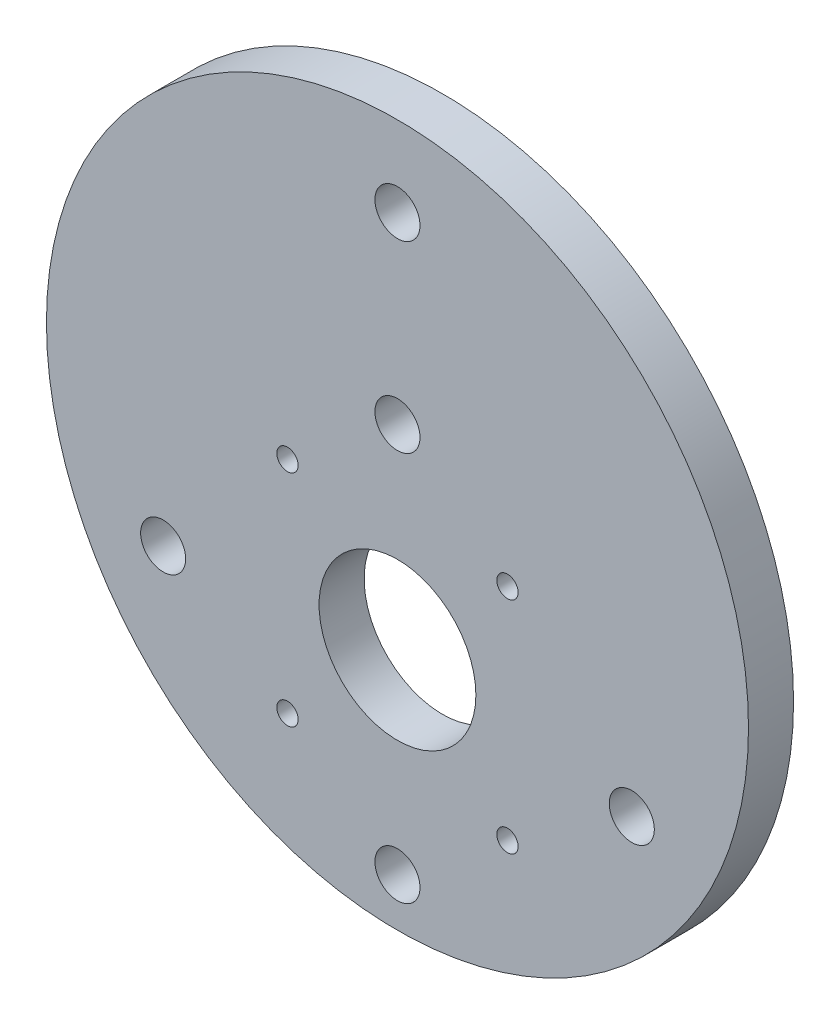
ISO-10303-21;
HEADER;
FILE_DESCRIPTION(('STEP AP214'),'2;1');
FILE_NAME('part.step','',(''),(''),'','','');
FILE_SCHEMA(('AUTOMOTIVE_DESIGN { 1 0 10303 214 1 1 1 1 }'));
ENDSEC;
DATA;
#1=APPLICATION_CONTEXT('core data for automotive mechanical design processes');
#2=APPLICATION_PROTOCOL_DEFINITION('international standard','automotive_design',2000,#1);
#3=PRODUCT_CONTEXT('',#1,'mechanical');
#4=PRODUCT('Part','Part','',(#3));
#5=PRODUCT_RELATED_PRODUCT_CATEGORY('part','',(#4));
#6=PRODUCT_DEFINITION_FORMATION('','',#4);
#7=PRODUCT_DEFINITION_CONTEXT('part definition',#1,'design');
#8=PRODUCT_DEFINITION('design','',#6,#7);
#9=PRODUCT_DEFINITION_SHAPE('','',#8);
#10=(LENGTH_UNIT() NAMED_UNIT(*) SI_UNIT(.MILLI.,.METRE.));
#11=(NAMED_UNIT(*) PLANE_ANGLE_UNIT() SI_UNIT($,.RADIAN.));
#12=(NAMED_UNIT(*) SI_UNIT($,.STERADIAN.) SOLID_ANGLE_UNIT());
#13=UNCERTAINTY_MEASURE_WITH_UNIT(LENGTH_MEASURE(1.E-05),#10,'distance_accuracy_value','');
#14=(GEOMETRIC_REPRESENTATION_CONTEXT(3) GLOBAL_UNCERTAINTY_ASSIGNED_CONTEXT((#13)) GLOBAL_UNIT_ASSIGNED_CONTEXT((#10,
#11,#12)) REPRESENTATION_CONTEXT('',''));
#15=CARTESIAN_POINT('',(0.,0.,0.));
#16=DIRECTION('',(0.,0.,1.));
#17=DIRECTION('',(1.,0.,0.));
#18=AXIS2_PLACEMENT_3D('',#15,#16,#17);
#19=CARTESIAN_POINT('',(0.,0.,6.35));
#20=DIRECTION('',(0.,0.,-1.));
#21=DIRECTION('',(-1.,0.,0.));
#22=AXIS2_PLACEMENT_3D('',#19,#20,#21);
#23=CYLINDRICAL_SURFACE('',#22,49.4665);
#24=CARTESIAN_POINT('',(0.,0.,6.35));
#25=DIRECTION('',(0.,0.,1.));
#26=DIRECTION('',(1.,0.,0.));
#27=AXIS2_PLACEMENT_3D('',#24,#25,#26);
#28=CIRCLE('',#27,49.4665);
#29=CARTESIAN_POINT('',(49.4665,0.,6.35));
#30=VERTEX_POINT('',#29);
#31=EDGE_CURVE('E10',#30,#30,#28,.T.);
#32=ORIENTED_EDGE('',*,*,#31,.F.);
#33=EDGE_LOOP('',(#32));
#34=FACE_BOUND('',#33,.T.);
#35=CARTESIAN_POINT('',(0.,0.,0.));
#36=DIRECTION('',(0.,0.,1.));
#37=DIRECTION('',(1.,0.,0.));
#38=AXIS2_PLACEMENT_3D('',#35,#36,#37);
#39=CIRCLE('',#38,49.4665);
#40=CARTESIAN_POINT('',(49.4665,0.,0.));
#41=VERTEX_POINT('',#40);
#42=EDGE_CURVE('E35',#41,#41,#39,.T.);
#43=ORIENTED_EDGE('',*,*,#42,.T.);
#44=EDGE_LOOP('',(#43));
#45=FACE_BOUND('',#44,.T.);
#46=ADVANCED_FACE('F32',(#34,#45),#23,.T.);
#47=CARTESIAN_POINT('',(0.,0.,6.35));
#48=DIRECTION('',(0.,0.,1.));
#49=DIRECTION('',(1.,0.,0.));
#50=AXIS2_PLACEMENT_3D('',#47,#48,#49);
#51=PLANE('',#50);
#52=CARTESIAN_POINT('',(0.,-15.24,6.35));
#53=DIRECTION('',(0.,0.,1.));
#54=DIRECTION('',(1.,0.,0.));
#55=AXIS2_PLACEMENT_3D('',#52,#53,#54);
#56=CIRCLE('',#55,11.049);
#57=CARTESIAN_POINT('',(11.049,-15.24,6.35));
#58=VERTEX_POINT('',#57);
#59=EDGE_CURVE('E98',#58,#58,#56,.T.);
#60=ORIENTED_EDGE('',*,*,#59,.F.);
#61=EDGE_LOOP('',(#60));
#62=FACE_BOUND('',#61,.T.);
#63=CARTESIAN_POINT('',(0.,38.128211777283,6.35));
#64=DIRECTION('',(0.,0.,1.));
#65=DIRECTION('',(1.,0.,0.));
#66=AXIS2_PLACEMENT_3D('',#63,#64,#65);
#67=CIRCLE('',#66,3.175);
#68=CARTESIAN_POINT('',(3.175,38.128211777283,6.35));
#69=VERTEX_POINT('',#68);
#70=EDGE_CURVE('E93',#69,#69,#67,.T.);
#71=ORIENTED_EDGE('',*,*,#70,.F.);
#72=EDGE_LOOP('',(#71));
#73=FACE_BOUND('',#72,.T.);
#74=CARTESIAN_POINT('',(-33.0200000000003,-19.0641058886412,6.35));
#75=DIRECTION('',(0.,0.,1.));
#76=DIRECTION('',(1.,0.,0.));
#77=AXIS2_PLACEMENT_3D('',#74,#75,#76);
#78=CIRCLE('',#77,3.175);
#79=CARTESIAN_POINT('',(-29.8450000000003,-19.0641058886412,6.35));
#80=VERTEX_POINT('',#79);
#81=EDGE_CURVE('E87',#80,#80,#78,.T.);
#82=ORIENTED_EDGE('',*,*,#81,.F.);
#83=EDGE_LOOP('',(#82));
#84=FACE_BOUND('',#83,.T.);
#85=CARTESIAN_POINT('',(33.0200000000003,-19.0641058886412,6.35));
#86=DIRECTION('',(0.,0.,1.));
#87=DIRECTION('',(1.,0.,0.));
#88=AXIS2_PLACEMENT_3D('',#85,#86,#87);
#89=CIRCLE('',#88,3.175);
#90=CARTESIAN_POINT('',(36.1950000000003,-19.0641058886412,6.35));
#91=VERTEX_POINT('',#90);
#92=EDGE_CURVE('E80',#91,#91,#89,.T.);
#93=ORIENTED_EDGE('',*,*,#92,.F.);
#94=EDGE_LOOP('',(#93));
#95=FACE_BOUND('',#94,.T.);
#96=CARTESIAN_POINT('',(0.,-42.672,6.35));
#97=DIRECTION('',(0.,0.,1.));
#98=DIRECTION('',(1.,0.,0.));
#99=AXIS2_PLACEMENT_3D('',#96,#97,#98);
#100=CIRCLE('',#99,3.175);
#101=CARTESIAN_POINT('',(3.17499999999999,-42.672,6.35));
#102=VERTEX_POINT('',#101);
#103=EDGE_CURVE('E75',#102,#102,#100,.T.);
#104=ORIENTED_EDGE('',*,*,#103,.F.);
#105=EDGE_LOOP('',(#104));
#106=FACE_BOUND('',#105,.T.);
#107=CARTESIAN_POINT('',(0.,12.26,6.35));
#108=DIRECTION('',(0.,0.,1.));
#109=DIRECTION('',(1.,0.,0.));
#110=AXIS2_PLACEMENT_3D('',#107,#108,#109);
#111=CIRCLE('',#110,3.175);
#112=CARTESIAN_POINT('',(3.175,12.26,6.35));
#113=VERTEX_POINT('',#112);
#114=EDGE_CURVE('E71',#113,#113,#111,.T.);
#115=ORIENTED_EDGE('',*,*,#114,.F.);
#116=EDGE_LOOP('',(#115));
#117=FACE_BOUND('',#116,.T.);
#118=CARTESIAN_POINT('',(15.5,0.260000000000003,6.35));
#119=DIRECTION('',(0.,0.,1.));
#120=DIRECTION('',(1.,0.,0.));
#121=AXIS2_PLACEMENT_3D('',#118,#119,#120);
#122=CIRCLE('',#121,1.5);
#123=CARTESIAN_POINT('',(17.,0.260000000000003,6.35));
#124=VERTEX_POINT('',#123);
#125=EDGE_CURVE('E64',#124,#124,#122,.T.);
#126=ORIENTED_EDGE('',*,*,#125,.F.);
#127=EDGE_LOOP('',(#126));
#128=FACE_BOUND('',#127,.T.);
#129=CARTESIAN_POINT('',(-15.5,0.260000000000003,6.35));
#130=DIRECTION('',(0.,0.,1.));
#131=DIRECTION('',(1.,0.,0.));
#132=AXIS2_PLACEMENT_3D('',#129,#130,#131);
#133=CIRCLE('',#132,1.5);
#134=CARTESIAN_POINT('',(-14.,0.260000000000003,6.35));
#135=VERTEX_POINT('',#134);
#136=EDGE_CURVE('E58',#135,#135,#133,.T.);
#137=ORIENTED_EDGE('',*,*,#136,.F.);
#138=EDGE_LOOP('',(#137));
#139=FACE_BOUND('',#138,.T.);
#140=CARTESIAN_POINT('',(-15.5,-30.74,6.35));
#141=DIRECTION('',(0.,0.,1.));
#142=DIRECTION('',(1.,0.,0.));
#143=AXIS2_PLACEMENT_3D('',#140,#141,#142);
#144=CIRCLE('',#143,1.5);
#145=CARTESIAN_POINT('',(-14.,-30.74,6.35));
#146=VERTEX_POINT('',#145);
#147=EDGE_CURVE('E52',#146,#146,#144,.T.);
#148=ORIENTED_EDGE('',*,*,#147,.F.);
#149=EDGE_LOOP('',(#148));
#150=FACE_BOUND('',#149,.T.);
#151=CARTESIAN_POINT('',(15.5,-30.74,6.35));
#152=DIRECTION('',(0.,0.,1.));
#153=DIRECTION('',(1.,0.,0.));
#154=AXIS2_PLACEMENT_3D('',#151,#152,#153);
#155=CIRCLE('',#154,1.5);
#156=CARTESIAN_POINT('',(17.,-30.74,6.35));
#157=VERTEX_POINT('',#156);
#158=EDGE_CURVE('E46',#157,#157,#155,.T.);
#159=ORIENTED_EDGE('',*,*,#158,.F.);
#160=EDGE_LOOP('',(#159));
#161=FACE_BOUND('',#160,.T.);
#162=ORIENTED_EDGE('',*,*,#31,.T.);
#163=EDGE_LOOP('',(#162));
#164=FACE_BOUND('',#163,.T.);
#165=ADVANCED_FACE('F114',(#62,#73,#84,#95,#106,#117,#128,#139,#150,#161,#164),#51,.T.);
#166=CARTESIAN_POINT('',(0.,0.,0.));
#167=DIRECTION('',(0.,0.,1.));
#168=DIRECTION('',(1.,0.,0.));
#169=AXIS2_PLACEMENT_3D('',#166,#167,#168);
#170=PLANE('',#169);
#171=CARTESIAN_POINT('',(0.,-15.24,0.));
#172=DIRECTION('',(0.,0.,1.));
#173=DIRECTION('',(1.,0.,0.));
#174=AXIS2_PLACEMENT_3D('',#171,#172,#173);
#175=CIRCLE('',#174,11.049);
#176=CARTESIAN_POINT('',(11.049,-15.24,0.));
#177=VERTEX_POINT('',#176);
#178=EDGE_CURVE('E84',#177,#177,#175,.T.);
#179=ORIENTED_EDGE('',*,*,#178,.T.);
#180=EDGE_LOOP('',(#179));
#181=FACE_BOUND('',#180,.T.);
#182=CARTESIAN_POINT('',(0.,38.128211777283,0.));
#183=DIRECTION('',(0.,0.,1.));
#184=DIRECTION('',(1.,0.,0.));
#185=AXIS2_PLACEMENT_3D('',#182,#183,#184);
#186=CIRCLE('',#185,3.175);
#187=CARTESIAN_POINT('',(3.175,38.128211777283,0.));
#188=VERTEX_POINT('',#187);
#189=EDGE_CURVE('E72',#188,#188,#186,.T.);
#190=ORIENTED_EDGE('',*,*,#189,.T.);
#191=EDGE_LOOP('',(#190));
#192=FACE_BOUND('',#191,.T.);
#193=CARTESIAN_POINT('',(-33.0200000000003,-19.0641058886412,0.));
#194=DIRECTION('',(0.,0.,1.));
#195=DIRECTION('',(1.,0.,0.));
#196=AXIS2_PLACEMENT_3D('',#193,#194,#195);
#197=CIRCLE('',#196,3.175);
#198=CARTESIAN_POINT('',(-29.8450000000003,-19.0641058886412,0.));
#199=VERTEX_POINT('',#198);
#200=EDGE_CURVE('E90',#199,#199,#197,.T.);
#201=ORIENTED_EDGE('',*,*,#200,.T.);
#202=EDGE_LOOP('',(#201));
#203=FACE_BOUND('',#202,.T.);
#204=CARTESIAN_POINT('',(33.0200000000003,-19.0641058886412,0.));
#205=DIRECTION('',(0.,0.,1.));
#206=DIRECTION('',(1.,0.,0.));
#207=AXIS2_PLACEMENT_3D('',#204,#205,#206);
#208=CIRCLE('',#207,3.175);
#209=CARTESIAN_POINT('',(36.1950000000003,-19.0641058886412,0.));
#210=VERTEX_POINT('',#209);
#211=EDGE_CURVE('E83',#210,#210,#208,.T.);
#212=ORIENTED_EDGE('',*,*,#211,.T.);
#213=EDGE_LOOP('',(#212));
#214=FACE_BOUND('',#213,.T.);
#215=CARTESIAN_POINT('',(0.,-42.672,0.));
#216=DIRECTION('',(0.,0.,1.));
#217=DIRECTION('',(1.,0.,0.));
#218=AXIS2_PLACEMENT_3D('',#215,#216,#217);
#219=CIRCLE('',#218,3.175);
#220=CARTESIAN_POINT('',(3.17499999999999,-42.672,0.));
#221=VERTEX_POINT('',#220);
#222=EDGE_CURVE('E67',#221,#221,#219,.T.);
#223=ORIENTED_EDGE('',*,*,#222,.T.);
#224=EDGE_LOOP('',(#223));
#225=FACE_BOUND('',#224,.T.);
#226=CARTESIAN_POINT('',(0.,12.26,0.));
#227=DIRECTION('',(0.,0.,1.));
#228=DIRECTION('',(1.,0.,0.));
#229=AXIS2_PLACEMENT_3D('',#226,#227,#228);
#230=CIRCLE('',#229,3.175);
#231=CARTESIAN_POINT('',(3.175,12.26,0.));
#232=VERTEX_POINT('',#231);
#233=EDGE_CURVE('E68',#232,#232,#230,.T.);
#234=ORIENTED_EDGE('',*,*,#233,.T.);
#235=EDGE_LOOP('',(#234));
#236=FACE_BOUND('',#235,.T.);
#237=CARTESIAN_POINT('',(15.5,0.260000000000003,0.));
#238=DIRECTION('',(0.,0.,1.));
#239=DIRECTION('',(1.,0.,0.));
#240=AXIS2_PLACEMENT_3D('',#237,#238,#239);
#241=CIRCLE('',#240,1.5);
#242=CARTESIAN_POINT('',(17.,0.260000000000003,0.));
#243=VERTEX_POINT('',#242);
#244=EDGE_CURVE('E61',#243,#243,#241,.T.);
#245=ORIENTED_EDGE('',*,*,#244,.T.);
#246=EDGE_LOOP('',(#245));
#247=FACE_BOUND('',#246,.T.);
#248=CARTESIAN_POINT('',(-15.5,0.260000000000003,0.));
#249=DIRECTION('',(0.,0.,1.));
#250=DIRECTION('',(1.,0.,0.));
#251=AXIS2_PLACEMENT_3D('',#248,#249,#250);
#252=CIRCLE('',#251,1.5);
#253=CARTESIAN_POINT('',(-14.,0.260000000000003,0.));
#254=VERTEX_POINT('',#253);
#255=EDGE_CURVE('E55',#254,#254,#252,.T.);
#256=ORIENTED_EDGE('',*,*,#255,.T.);
#257=EDGE_LOOP('',(#256));
#258=FACE_BOUND('',#257,.T.);
#259=CARTESIAN_POINT('',(-15.5,-30.74,0.));
#260=DIRECTION('',(0.,0.,1.));
#261=DIRECTION('',(1.,0.,0.));
#262=AXIS2_PLACEMENT_3D('',#259,#260,#261);
#263=CIRCLE('',#262,1.5);
#264=CARTESIAN_POINT('',(-14.,-30.74,0.));
#265=VERTEX_POINT('',#264);
#266=EDGE_CURVE('E49',#265,#265,#263,.T.);
#267=ORIENTED_EDGE('',*,*,#266,.T.);
#268=EDGE_LOOP('',(#267));
#269=FACE_BOUND('',#268,.T.);
#270=CARTESIAN_POINT('',(15.5,-30.74,0.));
#271=DIRECTION('',(0.,0.,1.));
#272=DIRECTION('',(1.,0.,0.));
#273=AXIS2_PLACEMENT_3D('',#270,#271,#272);
#274=CIRCLE('',#273,1.5);
#275=CARTESIAN_POINT('',(17.,-30.74,0.));
#276=VERTEX_POINT('',#275);
#277=EDGE_CURVE('E42',#276,#276,#274,.T.);
#278=ORIENTED_EDGE('',*,*,#277,.T.);
#279=EDGE_LOOP('',(#278));
#280=FACE_BOUND('',#279,.T.);
#281=ORIENTED_EDGE('',*,*,#42,.F.);
#282=EDGE_LOOP('',(#281));
#283=FACE_BOUND('',#282,.T.);
#284=ADVANCED_FACE('F104',(#181,#192,#203,#214,#225,#236,#247,#258,#269,#280,#283),#170,.F.);
#285=CARTESIAN_POINT('',(15.5,-30.74,6.35));
#286=DIRECTION('',(0.,0.,1.));
#287=DIRECTION('',(1.,0.,0.));
#288=AXIS2_PLACEMENT_3D('',#285,#286,#287);
#289=CYLINDRICAL_SURFACE('',#288,1.5);
#290=ORIENTED_EDGE('',*,*,#277,.F.);
#291=EDGE_LOOP('',(#290));
#292=FACE_BOUND('',#291,.T.);
#293=ORIENTED_EDGE('',*,*,#158,.T.);
#294=EDGE_LOOP('',(#293));
#295=FACE_BOUND('',#294,.T.);
#296=ADVANCED_FACE('F136',(#292,#295),#289,.F.);
#297=CARTESIAN_POINT('',(-15.5,-30.74,6.35));
#298=DIRECTION('',(0.,0.,1.));
#299=DIRECTION('',(1.,0.,0.));
#300=AXIS2_PLACEMENT_3D('',#297,#298,#299);
#301=CYLINDRICAL_SURFACE('',#300,1.5);
#302=ORIENTED_EDGE('',*,*,#266,.F.);
#303=EDGE_LOOP('',(#302));
#304=FACE_BOUND('',#303,.T.);
#305=ORIENTED_EDGE('',*,*,#147,.T.);
#306=EDGE_LOOP('',(#305));
#307=FACE_BOUND('',#306,.T.);
#308=ADVANCED_FACE('F138',(#304,#307),#301,.F.);
#309=CARTESIAN_POINT('',(-15.5,0.260000000000003,6.35));
#310=DIRECTION('',(0.,0.,1.));
#311=DIRECTION('',(1.,0.,0.));
#312=AXIS2_PLACEMENT_3D('',#309,#310,#311);
#313=CYLINDRICAL_SURFACE('',#312,1.5);
#314=ORIENTED_EDGE('',*,*,#255,.F.);
#315=EDGE_LOOP('',(#314));
#316=FACE_BOUND('',#315,.T.);
#317=ORIENTED_EDGE('',*,*,#136,.T.);
#318=EDGE_LOOP('',(#317));
#319=FACE_BOUND('',#318,.T.);
#320=ADVANCED_FACE('F145',(#316,#319),#313,.F.);
#321=CARTESIAN_POINT('',(15.5,0.260000000000003,6.35));
#322=DIRECTION('',(0.,0.,1.));
#323=DIRECTION('',(1.,0.,0.));
#324=AXIS2_PLACEMENT_3D('',#321,#322,#323);
#325=CYLINDRICAL_SURFACE('',#324,1.5);
#326=ORIENTED_EDGE('',*,*,#244,.F.);
#327=EDGE_LOOP('',(#326));
#328=FACE_BOUND('',#327,.T.);
#329=ORIENTED_EDGE('',*,*,#125,.T.);
#330=EDGE_LOOP('',(#329));
#331=FACE_BOUND('',#330,.T.);
#332=ADVANCED_FACE('F211',(#328,#331),#325,.F.);
#333=CARTESIAN_POINT('',(0.,12.26,0.));
#334=DIRECTION('',(0.,0.,1.));
#335=DIRECTION('',(1.,0.,0.));
#336=AXIS2_PLACEMENT_3D('',#333,#334,#335);
#337=CYLINDRICAL_SURFACE('',#336,3.175);
#338=ORIENTED_EDGE('',*,*,#233,.F.);
#339=EDGE_LOOP('',(#338));
#340=FACE_BOUND('',#339,.T.);
#341=ORIENTED_EDGE('',*,*,#114,.T.);
#342=EDGE_LOOP('',(#341));
#343=FACE_BOUND('',#342,.T.);
#344=ADVANCED_FACE('F203',(#340,#343),#337,.F.);
#345=CARTESIAN_POINT('',(0.,-42.672,0.));
#346=DIRECTION('',(0.,0.,1.));
#347=DIRECTION('',(1.,0.,0.));
#348=AXIS2_PLACEMENT_3D('',#345,#346,#347);
#349=CYLINDRICAL_SURFACE('',#348,3.175);
#350=ORIENTED_EDGE('',*,*,#222,.F.);
#351=EDGE_LOOP('',(#350));
#352=FACE_BOUND('',#351,.T.);
#353=ORIENTED_EDGE('',*,*,#103,.T.);
#354=EDGE_LOOP('',(#353));
#355=FACE_BOUND('',#354,.T.);
#356=ADVANCED_FACE('F195',(#352,#355),#349,.F.);
#357=CARTESIAN_POINT('',(33.0200000000003,-19.0641058886412,0.));
#358=DIRECTION('',(0.,0.,1.));
#359=DIRECTION('',(1.,0.,0.));
#360=AXIS2_PLACEMENT_3D('',#357,#358,#359);
#361=CYLINDRICAL_SURFACE('',#360,3.175);
#362=ORIENTED_EDGE('',*,*,#211,.F.);
#363=EDGE_LOOP('',(#362));
#364=FACE_BOUND('',#363,.T.);
#365=ORIENTED_EDGE('',*,*,#92,.T.);
#366=EDGE_LOOP('',(#365));
#367=FACE_BOUND('',#366,.T.);
#368=ADVANCED_FACE('F187',(#364,#367),#361,.F.);
#369=CARTESIAN_POINT('',(-33.0200000000003,-19.0641058886412,0.));
#370=DIRECTION('',(0.,0.,1.));
#371=DIRECTION('',(1.,0.,0.));
#372=AXIS2_PLACEMENT_3D('',#369,#370,#371);
#373=CYLINDRICAL_SURFACE('',#372,3.175);
#374=ORIENTED_EDGE('',*,*,#200,.F.);
#375=EDGE_LOOP('',(#374));
#376=FACE_BOUND('',#375,.T.);
#377=ORIENTED_EDGE('',*,*,#81,.T.);
#378=EDGE_LOOP('',(#377));
#379=FACE_BOUND('',#378,.T.);
#380=ADVANCED_FACE('F180',(#376,#379),#373,.F.);
#381=CARTESIAN_POINT('',(0.,38.128211777283,0.));
#382=DIRECTION('',(0.,0.,1.));
#383=DIRECTION('',(1.,0.,0.));
#384=AXIS2_PLACEMENT_3D('',#381,#382,#383);
#385=CYLINDRICAL_SURFACE('',#384,3.175);
#386=ORIENTED_EDGE('',*,*,#189,.F.);
#387=EDGE_LOOP('',(#386));
#388=FACE_BOUND('',#387,.T.);
#389=ORIENTED_EDGE('',*,*,#70,.T.);
#390=EDGE_LOOP('',(#389));
#391=FACE_BOUND('',#390,.T.);
#392=ADVANCED_FACE('F110',(#388,#391),#385,.F.);
#393=CARTESIAN_POINT('',(0.,-15.24,0.));
#394=DIRECTION('',(0.,0.,1.));
#395=DIRECTION('',(1.,0.,0.));
#396=AXIS2_PLACEMENT_3D('',#393,#394,#395);
#397=CYLINDRICAL_SURFACE('',#396,11.049);
#398=ORIENTED_EDGE('',*,*,#178,.F.);
#399=EDGE_LOOP('',(#398));
#400=FACE_BOUND('',#399,.T.);
#401=ORIENTED_EDGE('',*,*,#59,.T.);
#402=EDGE_LOOP('',(#401));
#403=FACE_BOUND('',#402,.T.);
#404=ADVANCED_FACE('F107',(#400,#403),#397,.F.);
#405=CLOSED_SHELL('',(#46,#165,#284,#296,#308,#320,#332,#344,#356,#368,#380,#392,#404));
#406=MANIFOLD_SOLID_BREP('B2',#405);
#407=ADVANCED_BREP_SHAPE_REPRESENTATION('',(#18,#406),#14);
#408=SHAPE_DEFINITION_REPRESENTATION(#9,#407);
ENDSEC;
END-ISO-10303-21;
